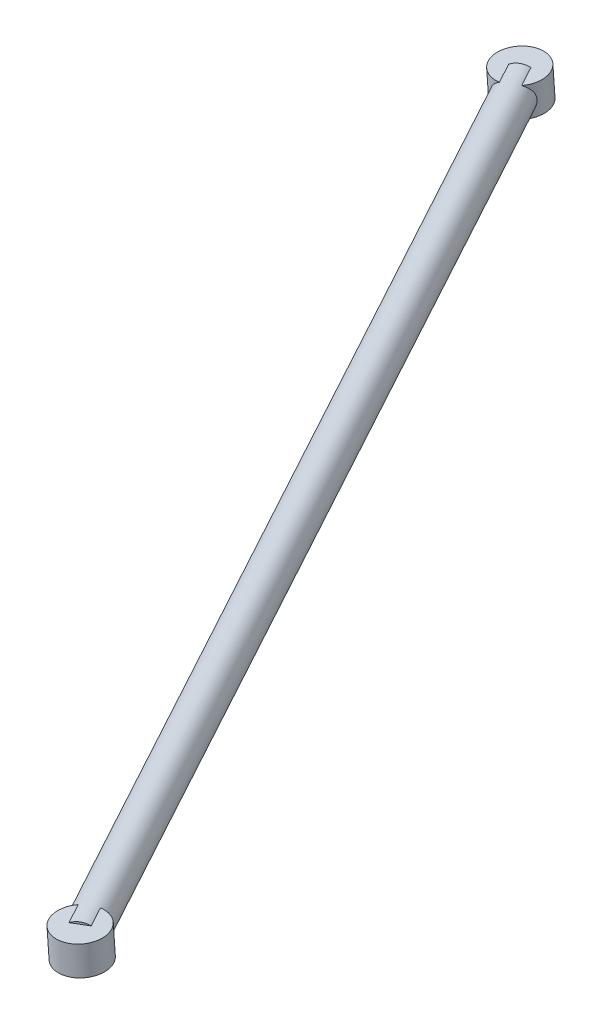
ISO-10303-21;
HEADER;
FILE_DESCRIPTION(('STEP AP214'),'2;1');
FILE_NAME('part.step','',(''),(''),'','','');
FILE_SCHEMA(('AUTOMOTIVE_DESIGN { 1 0 10303 214 1 1 1 1 }'));
ENDSEC;
DATA;
#1=APPLICATION_CONTEXT('core data for automotive mechanical design processes');
#2=APPLICATION_PROTOCOL_DEFINITION('international standard','automotive_design',2000,#1);
#3=PRODUCT_CONTEXT('',#1,'mechanical');
#4=PRODUCT('Part','Part','',(#3));
#5=PRODUCT_RELATED_PRODUCT_CATEGORY('part','',(#4));
#6=PRODUCT_DEFINITION_FORMATION('','',#4);
#7=PRODUCT_DEFINITION_CONTEXT('part definition',#1,'design');
#8=PRODUCT_DEFINITION('design','',#6,#7);
#9=PRODUCT_DEFINITION_SHAPE('','',#8);
#10=(LENGTH_UNIT() NAMED_UNIT(*) SI_UNIT(.MILLI.,.METRE.));
#11=(NAMED_UNIT(*) PLANE_ANGLE_UNIT() SI_UNIT($,.RADIAN.));
#12=(NAMED_UNIT(*) SI_UNIT($,.STERADIAN.) SOLID_ANGLE_UNIT());
#13=UNCERTAINTY_MEASURE_WITH_UNIT(LENGTH_MEASURE(1.E-05),#10,'distance_accuracy_value','');
#14=(GEOMETRIC_REPRESENTATION_CONTEXT(3) GLOBAL_UNCERTAINTY_ASSIGNED_CONTEXT((#13)) GLOBAL_UNIT_ASSIGNED_CONTEXT((#10,
#11,#12)) REPRESENTATION_CONTEXT('',''));
#15=CARTESIAN_POINT('',(0.,0.,0.));
#16=DIRECTION('',(0.,0.,1.));
#17=DIRECTION('',(1.,0.,0.));
#18=AXIS2_PLACEMENT_3D('',#15,#16,#17);
#19=CARTESIAN_POINT('',(535.6,-114.51,-83.23));
#20=DIRECTION('',(-0.464028683221349,0.0373067621610558,-0.885034229080954));
#21=DIRECTION('',(-0.885650765612241,0.,0.464351936972866));
#22=AXIS2_PLACEMENT_3D('',#19,#20,#21);
#23=CYLINDRICAL_SURFACE('',#22,7.99999999999999);
#24=CARTESIAN_POINT('',(527.257280147066,-107.296869973545,-90.184838852364));
#25=CARTESIAN_POINT('',(527.10912755688,-107.425437559921,-90.0227289563676));
#26=CARTESIAN_POINT('',(526.969476489393,-107.562605761105,-89.8598778253267));
#27=CARTESIAN_POINT('',(526.706769329285,-107.852602875344,-89.5350441192964));
#28=CARTESIAN_POINT('',(526.583699240574,-108.005418386183,-89.3730609240105));
#29=CARTESIAN_POINT('',(526.353124696478,-108.325909012441,-89.0515133267569));
#30=CARTESIAN_POINT('',(526.245671740722,-108.493630478055,-88.8919584144551));
#31=CARTESIAN_POINT('',(526.046023508878,-108.842475782773,-88.5779672454534));
#32=CARTESIAN_POINT('',(525.953831630866,-109.023602593792,-88.4235321348494));
#33=CARTESIAN_POINT('',(525.784146705437,-109.397896585341,-88.1225573528193));
#34=CARTESIAN_POINT('',(525.7066134234,-109.591028816219,-87.9759968837643));
#35=CARTESIAN_POINT('',(525.565074365398,-109.989235986968,-87.692858441975));
#36=CARTESIAN_POINT('',(525.501069669532,-110.194311878733,-87.5562812668585));
#37=CARTESIAN_POINT('',(525.385843311899,-110.61569715854,-87.2962935818472));
#38=CARTESIAN_POINT('',(525.33460284929,-110.831989450986,-87.1728638620028));
#39=CARTESIAN_POINT('',(525.24402171483,-111.275449959265,-86.9425723039694));
#40=CARTESIAN_POINT('',(525.204675506583,-111.502613057875,-86.83570276887));
#41=CARTESIAN_POINT('',(525.124921257572,-112.051302025162,-86.6078062109818));
#42=CARTESIAN_POINT('',(525.08923407072,-112.377348393684,-86.4955416386317));
#43=CARTESIAN_POINT('',(525.050068802157,-112.876948738949,-86.3649718756491));
#44=CARTESIAN_POINT('',(525.03940973437,-113.04514938127,-86.3277624322701));
#45=CARTESIAN_POINT('',(525.022702354311,-113.384230056956,-86.2672446855995));
#46=CARTESIAN_POINT('',(525.016651694678,-113.555108680921,-86.2439293064763));
#47=CARTESIAN_POINT('',(525.009009366558,-113.899830257075,-86.2121480596217));
#48=CARTESIAN_POINT('',(525.007456308939,-114.073686063011,-86.203811007261));
#49=CARTESIAN_POINT('',(525.008838544873,-114.421424396282,-86.202997527529));
#50=CARTESIAN_POINT('',(525.011773747156,-114.595306923002,-86.21052077763));
#51=CARTESIAN_POINT('',(525.022099169581,-114.941577840237,-86.2414166004957));
#52=CARTESIAN_POINT('',(525.029490921372,-115.113965696385,-86.2647946226495));
#53=CARTESIAN_POINT('',(525.04874319947,-115.455719661553,-86.3267455981055));
#54=CARTESIAN_POINT('',(525.060603764002,-115.625085744712,-86.3653186813827));
#55=CARTESIAN_POINT('',(525.087450163204,-115.942939176756,-86.4519465912168));
#56=CARTESIAN_POINT('',(525.102007721756,-116.091827452161,-86.4986764477566));
#57=CARTESIAN_POINT('',(525.134878192911,-116.385565878789,-86.602435544608));
#58=CARTESIAN_POINT('',(525.153192456153,-116.530414556328,-86.659468488283));
#59=CARTESIAN_POINT('',(525.213960169843,-116.958350233291,-86.8443689877527));
#60=CARTESIAN_POINT('',(525.262233435586,-117.23476493686,-86.9860205296479));
#61=CARTESIAN_POINT('',(525.363332517415,-117.710999539687,-87.2638635671444));
#62=CARTESIAN_POINT('',(525.413022092052,-117.914631908435,-87.3948429166545));
#63=CARTESIAN_POINT('',(525.523405764053,-118.309554956389,-87.6702995489685));
#64=CARTESIAN_POINT('',(525.584104839005,-118.500839999893,-87.8147829228002));
#65=CARTESIAN_POINT('',(525.717315705973,-118.871115067066,-88.1142536935648));
#66=CARTESIAN_POINT('',(525.789845450591,-119.050085808051,-88.2692568418079));
#67=CARTESIAN_POINT('',(525.94741071971,-119.395261240446,-88.5868905265932));
#68=CARTESIAN_POINT('',(526.032445071125,-119.561467127133,-88.7495203466848));
#69=CARTESIAN_POINT('',(526.214060026757,-119.877778982143,-89.0769657238344));
#70=CARTESIAN_POINT('',(526.310393429778,-120.028128936631,-89.241682665741));
#71=CARTESIAN_POINT('',(526.516493864179,-120.315640934559,-89.5741387392949));
#72=CARTESIAN_POINT('',(526.626258052445,-120.452805758172,-89.7418772249332));
#73=CARTESIAN_POINT('',(526.859551641261,-120.712880099335,-90.0780053971208));
#74=CARTESIAN_POINT('',(526.983045853992,-120.835824482007,-90.2463923980572));
#75=CARTESIAN_POINT('',(527.244515286275,-121.066898989694,-90.5823345370064));
#76=CARTESIAN_POINT('',(527.382501714152,-121.175017497106,-90.7498889246175));
#77=CARTESIAN_POINT('',(527.527885217287,-121.275148551619,-90.9159437152941));
#78=B_SPLINE_CURVE_WITH_KNOTS('',3,(#24,#25,#26,#27,#28,#29,#30,#31,#32,#33,#34,#35,#36,#37,#38,
#39,#40,#41,#42,#43,#44,#45,#46,#47,#48,#49,#50,#51,#52,#53,#54,#55,#56,#57,#58,#59,#60,#61,#62,
#63,#64,#65,#66,#67,#68,#69,#70,#71,#72,#73,#74,#75,#76,#77),.UNSPECIFIED.,.F.,.F.,(4,2,2,2,2,2,
2,2,2,2,2,2,2,2,2,2,2,2,2,2,2,2,2,2,2,2,4),(0.,0.762953061553605,1.52525802070631,
2.29002236651429,3.05495676864395,3.81776010385361,4.58062431696865,5.34235814945922,
6.1037368713343,7.13931927468659,7.65658625494786,8.17358958096658,8.6950182910626,
9.21643639772938,9.73803381010951,10.2596356842124,10.7293487092791,11.1992309061378,
12.1391873862655,12.8798164803661,13.6207812644578,14.3628810779214,15.1049113175282,
15.8329875081596,16.5609098406965,17.2870078536673,18.0136716271703),.UNSPECIFIED.);
#79=CARTESIAN_POINT('',(527.257280147066,-107.296869973545,-90.184838852364));
#80=VERTEX_POINT('',#79);
#81=CARTESIAN_POINT('',(527.527885217287,-121.275148551619,-90.9159437152941));
#82=VERTEX_POINT('',#81);
#83=EDGE_CURVE('E235',#80,#82,#78,.T.);
#84=ORIENTED_EDGE('',*,*,#83,.F.);
#85=CARTESIAN_POINT('',(525.336437695948,-107.142249855229,-93.8490286121603));
#86=CARTESIAN_POINT('',(526.589624302703,-107.243126355135,-91.4584558893537));
#87=CARTESIAN_POINT('',(527.842810924921,-107.344002854318,-89.067883174623));
#88=CARTESIAN_POINT('',(530.349184200286,-107.545755851236,-84.2867377613137));
#89=CARTESIAN_POINT('',(531.602370853432,-107.646632348972,-81.896165062735));
#90=CARTESIAN_POINT('',(532.855557522043,-107.747508845984,-79.5055923722323));
#91=B_SPLINE_CURVE_WITH_KNOTS('',3,(#85,#86,#87,#88,#89,#90),.UNSPECIFIED.,.F.,.F.,(4,2,4),(0.,
8.10304980507245,16.2060996101449),.UNSPECIFIED.);
#92=CARTESIAN_POINT('',(532.03412837787,-107.681387096497,-81.0725465500727));
#93=VERTEX_POINT('',#92);
#94=EDGE_CURVE('E145',#80,#93,#91,.T.);
#95=ORIENTED_EDGE('',*,*,#94,.T.);
#96=CARTESIAN_POINT('',(535.6,-114.51,-83.23));
#97=DIRECTION('',(-0.46402868322135,0.0373067621610557,-0.885034229080954));
#98=DIRECTION('',(-0.88565076561224,0.,0.464351936972866));
#99=AXIS2_PLACEMENT_3D('',#96,#97,#98);
#100=CIRCLE('',#99,7.99999999999999);
#101=CARTESIAN_POINT('',(538.894012428525,-107.360393009539,-84.6556935163909));
#102=VERTEX_POINT('',#101);
#103=EDGE_CURVE('E133',#93,#102,#100,.T.);
#104=ORIENTED_EDGE('',*,*,#103,.T.);
#105=CARTESIAN_POINT('',(541.5947027643,-107.57769751709,-79.5055923722315));
#106=CARTESIAN_POINT('',(540.341096981445,-107.476829162242,-81.8961650950414));
#107=CARTESIAN_POINT('',(539.087491183128,-107.375960808118,-84.2867378097737));
#108=CARTESIAN_POINT('',(536.58027955557,-107.174224101317,-89.0678832230832));
#109=CARTESIAN_POINT('',(535.32667372633,-107.07335574864,-91.4584559216605));
#110=CARTESIAN_POINT('',(534.073067881628,-106.972487396687,-93.8490286121603));
#111=B_SPLINE_CURVE_WITH_KNOTS('',3,(#105,#106,#107,#108,#109,#110),.UNSPECIFIED.,.F.,.F.,(4,2,
4),(0.,8.10363242266971,16.2072648453394),.UNSPECIFIED.);
#112=CARTESIAN_POINT('',(534.115909924604,-106.975934577703,-93.7673306698656));
#113=VERTEX_POINT('',#112);
#114=EDGE_CURVE('E241',#102,#113,#111,.T.);
#115=ORIENTED_EDGE('',*,*,#114,.T.);
#116=CARTESIAN_POINT('',(534.389023241594,-120.954095787557,-94.4997456740078));
#117=CARTESIAN_POINT('',(534.610980211892,-120.831415772004,-94.5210541644231));
#118=CARTESIAN_POINT('',(534.829000707599,-120.700503190521,-94.5343919098478));
#119=CARTESIAN_POINT('',(535.255417060849,-120.423579423923,-94.5468957710836));
#120=CARTESIAN_POINT('',(535.463820931756,-120.277581150554,-94.546073907766));
#121=CARTESIAN_POINT('',(535.870292201579,-119.971144161829,-94.5320358415843));
#122=CARTESIAN_POINT('',(536.068323907051,-119.810660174137,-94.5187794732207));
#123=CARTESIAN_POINT('',(536.451954594611,-119.476517552618,-94.4817519628768));
#124=CARTESIAN_POINT('',(536.637550803835,-119.302855998748,-94.4579784847182));
#125=CARTESIAN_POINT('',(536.994300966461,-118.943512695603,-94.4020398770927));
#126=CARTESIAN_POINT('',(537.16549367,-118.757865738516,-94.3698982824113));
#127=CARTESIAN_POINT('',(537.49238450858,-118.37447042685,-94.2993753905211));
#128=CARTESIAN_POINT('',(537.648081402753,-118.176721105186,-94.2609935942582));
#129=CARTESIAN_POINT('',(537.941762149753,-117.769593262585,-94.1804542535501));
#130=CARTESIAN_POINT('',(538.079772017751,-117.560232485797,-94.1383024130552));
#131=CARTESIAN_POINT('',(538.335774734013,-117.129982158138,-94.0529003145825));
#132=CARTESIAN_POINT('',(538.45377689797,-116.909098035592,-94.009650578635));
#133=CARTESIAN_POINT('',(538.705211872895,-116.374193107193,-93.9097901328085));
#134=CARTESIAN_POINT('',(538.828922287349,-116.055254849475,-93.8539706368417));
#135=CARTESIAN_POINT('',(538.97560627045,-115.564356536152,-93.7791857248859));
#136=CARTESIAN_POINT('',(539.018009000561,-115.398729048744,-93.7557577549481));
#137=CARTESIAN_POINT('',(539.088866028996,-115.064048025769,-93.7128152362971));
#138=CARTESIAN_POINT('',(539.117327423392,-114.894996278861,-93.6932986996786));
#139=CARTESIAN_POINT('',(539.159619694059,-114.553117205681,-93.6588213526348));
#140=CARTESIAN_POINT('',(539.173323428548,-114.380269958052,-93.643900910755));
#141=CARTESIAN_POINT('',(539.185154057171,-114.033661257375,-93.61935680581));
#142=CARTESIAN_POINT('',(539.183281266609,-113.859899822902,-93.6097330355325));
#143=CARTESIAN_POINT('',(539.163935750525,-113.512977832624,-93.5959024910247));
#144=CARTESIAN_POINT('',(539.146457628108,-113.339817505503,-93.591697592068));
#145=CARTESIAN_POINT('',(539.09637903327,-112.995663930137,-93.5884228222426));
#146=CARTESIAN_POINT('',(539.063778429536,-112.824670700723,-93.5893529959647));
#147=CARTESIAN_POINT('',(538.988289878648,-112.502954382735,-93.5953943613703));
#148=CARTESIAN_POINT('',(538.946744984023,-112.351904596349,-93.6000811900099));
#149=CARTESIAN_POINT('',(538.852919402203,-112.053283391331,-93.6124707119104));
#150=CARTESIAN_POINT('',(538.800634853583,-111.905713245133,-93.620174490817));
#151=CARTESIAN_POINT('',(538.628902384364,-111.468886906582,-93.6467548584687));
#152=CARTESIAN_POINT('',(538.494590925829,-111.185577510437,-93.669098747367));
#153=CARTESIAN_POINT('',(538.225216000522,-110.6958408048,-93.7120083514435));
#154=CARTESIAN_POINT('',(538.096348556287,-110.485847627326,-93.7319468020238));
#155=CARTESIAN_POINT('',(537.820834791308,-110.077661506663,-93.7712429379006));
#156=CARTESIAN_POINT('',(537.674180439072,-109.879473954857,-93.7906003558799));
#157=CARTESIAN_POINT('',(537.365093487589,-109.495078787826,-93.8263710001148));
#158=CARTESIAN_POINT('',(537.202637092034,-109.308889964931,-93.8427796766604));
#159=CARTESIAN_POINT('',(536.863897681495,-108.949176027623,-93.8704847669769));
#160=CARTESIAN_POINT('',(536.687615965149,-108.775649726744,-93.8817816602341));
#161=CARTESIAN_POINT('',(536.326151187843,-108.444933805437,-93.8971877149796));
#162=CARTESIAN_POINT('',(536.141199892002,-108.287497055598,-93.9014289324117));
#163=CARTESIAN_POINT('',(535.760713526742,-107.986041824039,-93.9014580679447));
#164=CARTESIAN_POINT('',(535.565180704381,-107.842020511001,-93.897247773979));
#165=CARTESIAN_POINT('',(535.16525181661,-107.568628064916,-93.8788292390801));
#166=CARTESIAN_POINT('',(534.960879129692,-107.439221208952,-93.8646460176022));
#167=CARTESIAN_POINT('',(534.544063120109,-107.195739171464,-93.8248907803468));
#168=CARTESIAN_POINT('',(534.331613628378,-107.081676023993,-93.7993098924157));
#169=CARTESIAN_POINT('',(534.115909924603,-106.975934577703,-93.7673306698656));
#170=B_SPLINE_CURVE_WITH_KNOTS('',3,(#116,#117,#118,#119,#120,#121,#122,#123,#124,#125,#126,
#127,#128,#129,#130,#131,#132,#133,#134,#135,#136,#137,#138,#139,#140,#141,#142,#143,#144,#145,
#146,#147,#148,#149,#150,#151,#152,#153,#154,#155,#156,#157,#158,#159,#160,#161,#162,#163,#164,
#165,#166,#167,#168,#169),.UNSPECIFIED.,.F.,.F.,(4,2,2,2,2,2,2,2,2,2,2,2,2,2,2,2,2,2,2,2,2,2,2,
2,2,2,4),(0.,0.763017342065641,1.52538694865104,2.29022764606423,3.05523832385197,
3.81812027380767,4.58106326455516,5.3428708678139,6.10432278949611,7.13972593898718,
7.6569035313707,8.17381760861144,8.69515028404995,9.21647240657171,9.73797489124076,
10.2594819044264,10.7292013609397,11.1990900009192,12.1390591859546,12.8797532323708,
13.6207829853056,14.3629464602414,15.1050403056596,15.8330818833565,16.560969458701,
17.2870374405321,18.0136715971829),.UNSPECIFIED.);
#171=CARTESIAN_POINT('',(534.389023241594,-120.954095787557,-94.4997456740078));
#172=VERTEX_POINT('',#171);
#173=EDGE_CURVE('E213',#172,#113,#170,.T.);
#174=ORIENTED_EDGE('',*,*,#173,.F.);
#175=CARTESIAN_POINT('',(542.24926238152,-121.586813490172,-79.505592372232));
#176=CARTESIAN_POINT('',(540.932100647346,-121.480787252857,-82.0182036633885));
#177=CARTESIAN_POINT('',(539.614938896097,-121.374761016341,-84.5308149456274));
#178=CARTESIAN_POINT('',(536.980615359447,-121.162708544907,-89.5560374922698));
#179=CARTESIAN_POINT('',(535.663453574046,-121.056682309989,-92.0686487566733));
#180=CARTESIAN_POINT('',(534.34629177157,-120.950656075869,-94.5812600121591));
#181=B_SPLINE_CURVE_WITH_KNOTS('',3,(#175,#176,#177,#178,#179,#180),.UNSPECIFIED.,.F.,.F.,(4,2,
4),(0.,8.51670997960851,17.033419959217),.UNSPECIFIED.);
#182=CARTESIAN_POINT('',(539.165871622131,-121.338612903503,-85.3874534499273));
#183=VERTEX_POINT('',#182);
#184=EDGE_CURVE('E220',#183,#172,#181,.T.);
#185=ORIENTED_EDGE('',*,*,#184,.F.);
#186=CARTESIAN_POINT('',(532.305987571475,-121.659606990461,-81.804306483609));
#187=VERTEX_POINT('',#186);
#188=EDGE_CURVE('E209',#183,#187,#100,.T.);
#189=ORIENTED_EDGE('',*,*,#188,.T.);
#190=CARTESIAN_POINT('',(525.605809580209,-121.120493383174,-94.5812600121603));
#191=CARTESIAN_POINT('',(526.923411805573,-121.226511061254,-92.0686487210001));
#192=CARTESIAN_POINT('',(528.24101404801,-121.332528738536,-89.5560374387594));
#193=CARTESIAN_POINT('',(530.87621856703,-121.544564091501,-84.5308148921166));
#194=CARTESIAN_POINT('',(532.193820843613,-121.650581767185,-82.0182036277146));
#195=CARTESIAN_POINT('',(533.511423137269,-121.75659944207,-79.505592372232));
#196=B_SPLINE_CURVE_WITH_KNOTS('',3,(#190,#191,#192,#193,#194,#195),.UNSPECIFIED.,.F.,.F.,(4,2,
4),(0.,8.5173222232888,17.0346444465776),.UNSPECIFIED.);
#197=EDGE_CURVE('E148',#82,#187,#196,.T.);
#198=ORIENTED_EDGE('',*,*,#197,.F.);
#199=EDGE_LOOP('',(#84,#95,#104,#115,#174,#185,#189,#198));
#200=FACE_BOUND('',#199,.T.);
#201=CARTESIAN_POINT('',(316.632815536966,-89.4914519064076,-508.572356838366));
#202=CARTESIAN_POINT('',(316.785483768125,-89.5966021396736,-508.746727654681));
#203=CARTESIAN_POINT('',(316.929987291129,-89.7105511883142,-508.922748362133));
#204=CARTESIAN_POINT('',(317.20301871195,-89.9547458001318,-509.275589529627));
#205=CARTESIAN_POINT('',(317.331560067543,-90.0849774468725,-509.452409183899));
#206=CARTESIAN_POINT('',(317.573670289178,-90.3610654643405,-509.805223112494));
#207=CARTESIAN_POINT('',(317.687189273789,-90.506971111869,-509.981212853761));
#208=CARTESIAN_POINT('',(317.899509903305,-90.8132274845533,-510.329525719559));
#209=CARTESIAN_POINT('',(317.998308271781,-90.9735814128161,-510.501848020519));
#210=CARTESIAN_POINT('',(318.181699855584,-91.3076499622713,-510.839920768989));
#211=CARTESIAN_POINT('',(318.266331833314,-91.4813261642698,-511.005688169123));
#212=CARTESIAN_POINT('',(318.422561411791,-91.8421149201933,-511.328561043239));
#213=CARTESIAN_POINT('',(318.49415796907,-92.029228548097,-511.485665823089));
#214=CARTESIAN_POINT('',(318.625039420475,-92.4164899478564,-511.787968215172));
#215=CARTESIAN_POINT('',(318.684342477925,-92.616617908257,-511.933183199397));
#216=CARTESIAN_POINT('',(318.791513139722,-93.0298743580247,-512.208282897123));
#217=CARTESIAN_POINT('',(318.839386070265,-93.2429967339214,-512.338174736551));
#218=CARTESIAN_POINT('',(318.939794885391,-93.7614378839896,-512.62181490633));
#219=CARTESIAN_POINT('',(318.987811818933,-94.0723405001403,-512.76733329071));
#220=CARTESIAN_POINT('',(319.045974310715,-94.5536534150233,-512.949116288999));
#221=CARTESIAN_POINT('',(319.063046176602,-94.7164978999605,-513.003609802496));
#222=CARTESIAN_POINT('',(319.092716686634,-95.0464749180424,-513.099061161865));
#223=CARTESIAN_POINT('',(319.105317605566,-95.213605224041,-513.140025890355));
#224=CARTESIAN_POINT('',(319.126210303377,-95.5525276524429,-513.207506804461));
#225=CARTESIAN_POINT('',(319.134464326893,-95.7243474121665,-513.233896490358));
#226=CARTESIAN_POINT('',(319.146522299986,-96.0698382516821,-513.270918358782));
#227=CARTESIAN_POINT('',(319.150326339638,-96.243509293929,-513.281550860263));
#228=CARTESIAN_POINT('',(319.153458504864,-96.5911899050319,-513.286912583808));
#229=CARTESIAN_POINT('',(319.15278508144,-96.7651995702209,-513.281636302507));
#230=CARTESIAN_POINT('',(319.146887891775,-97.1119723627681,-513.255673011368));
#231=CARTESIAN_POINT('',(319.14166408602,-97.2847354792887,-513.234985867708));
#232=CARTESIAN_POINT('',(319.127304913208,-97.6106560051234,-513.182014002963));
#233=CARTESIAN_POINT('',(319.118609490927,-97.7640566803199,-513.151084962077));
#234=CARTESIAN_POINT('',(319.097329953771,-98.068063984377,-513.078572159694));
#235=CARTESIAN_POINT('',(319.084744439397,-98.218669586978,-513.036984564592));
#236=CARTESIAN_POINT('',(319.040938188132,-98.6655816008062,-512.89782107929));
#237=CARTESIAN_POINT('',(319.003670414456,-98.9569196816866,-512.785855599297));
#238=CARTESIAN_POINT('',(318.921607258089,-99.4631011997901,-512.559378097565));
#239=CARTESIAN_POINT('',(318.88008273161,-99.6810675215521,-512.450438205575));
#240=CARTESIAN_POINT('',(318.78558262535,-100.106567682701,-512.21787142016));
#241=CARTESIAN_POINT('',(318.732601864111,-100.314096748975,-512.094237892489));
#242=CARTESIAN_POINT('',(318.614377224977,-100.718487079936,-511.83526809031));
#243=CARTESIAN_POINT('',(318.549114709428,-100.915331537915,-511.699914200849));
#244=CARTESIAN_POINT('',(318.405609698378,-101.297611102104,-511.42031670488));
#245=CARTESIAN_POINT('',(318.327368421231,-101.483047277005,-511.276073933594));
#246=CARTESIAN_POINT('',(318.158736326943,-101.838567937464,-510.983780568162));
#247=CARTESIAN_POINT('',(318.068603631502,-102.008876631956,-510.835853802143));
#248=CARTESIAN_POINT('',(317.874409346813,-102.337222774681,-510.535649785588));
#249=CARTESIAN_POINT('',(317.770350707973,-102.495262811028,-510.383373461927));
#250=CARTESIAN_POINT('',(317.547926829505,-102.797776891673,-510.076716377842));
#251=CARTESIAN_POINT('',(317.429598004133,-102.94228386095,-509.922341829733));
#252=CARTESIAN_POINT('',(317.177894842557,-103.217047799838,-509.612907191413));
#253=CARTESIAN_POINT('',(317.044508846079,-103.347293569681,-509.457846660498));
#254=CARTESIAN_POINT('',(316.903419332778,-103.469730383984,-509.303460875474));
#255=B_SPLINE_CURVE_WITH_KNOTS('',3,(#201,#202,#203,#204,#205,#206,#207,#208,#209,#210,#211,
#212,#213,#214,#215,#216,#217,#218,#219,#220,#221,#222,#223,#224,#225,#226,#227,#228,#229,#230,
#231,#232,#233,#234,#235,#236,#237,#238,#239,#240,#241,#242,#243,#244,#245,#246,#247,#248,#249,
#250,#251,#252,#253,#254),.UNSPECIFIED.,.F.,.F.,(4,2,2,2,2,2,2,2,2,2,2,2,2,2,2,2,2,2,2,2,2,2,2,
2,2,2,4),(0.,0.76301738512536,1.52538703508249,2.29022778475781,3.05523851474038,
3.81812051882214,4.5810635638203,5.34287121751485,6.10432318920499,7.13972619948522,
7.65690372245433,8.17381773038799,8.69515033123654,9.21647237920736,9.73797479013868,
10.2594817296383,10.7292011909186,11.1990898356739,12.1390590301421,12.8797531323946,
13.6207829412081,14.3629464709669,15.1050403710881,15.8330818400927,16.5609693066479,
17.2870371827904,18.0136712338322),.UNSPECIFIED.);
#256=CARTESIAN_POINT('',(316.632815536966,-89.4914519064076,-508.572356838366));
#257=VERTEX_POINT('',#256);
#258=CARTESIAN_POINT('',(316.903419332778,-103.469730383984,-509.303460875474));
#259=VERTEX_POINT('',#258);
#260=EDGE_CURVE('E12',#257,#259,#255,.T.);
#261=ORIENTED_EDGE('',*,*,#260,.F.);
#262=CARTESIAN_POINT('',(318.554891940629,-89.646107262906,-504.907039712893));
#263=CARTESIAN_POINT('',(317.237289463604,-89.5400894779449,-507.419651049913));
#264=CARTESIAN_POINT('',(315.919686969471,-89.4340716937843,-509.932262377996));
#265=CARTESIAN_POINT('',(313.284481946989,-89.2220361270644,-514.957485016288));
#266=CARTESIAN_POINT('',(311.966879418641,-89.1160183445051,-517.470096326496));
#267=CARTESIAN_POINT('',(310.649276873185,-89.0100005627463,-519.982707627767));
#268=B_SPLINE_CURVE_WITH_KNOTS('',3,(#262,#263,#264,#265,#266,#267),.UNSPECIFIED.,.F.,.F.,(4,2,
4),(0.,8.51732270740299,17.0346454148062),.UNSPECIFIED.);
#269=CARTESIAN_POINT('',(311.85471259849,-89.1069931064312,-517.683993609589));
#270=VERTEX_POINT('',#269);
#271=EDGE_CURVE('E192',#257,#270,#268,.T.);
#272=ORIENTED_EDGE('',*,*,#271,.T.);
#273=CARTESIAN_POINT('',(308.5607,-96.2566,-516.2583));
#274=DIRECTION('',(-0.46402868322135,0.0373067621610557,-0.885034229080954));
#275=DIRECTION('',(-0.88565076561224,0.,0.464351936972866));
#276=AXIS2_PLACEMENT_3D('',#273,#274,#275);
#277=CIRCLE('',#276,7.99999999999999);
#278=CARTESIAN_POINT('',(304.99482796191,-89.4279873788534,-514.100846343885));
#279=VERTEX_POINT('',#278);
#280=EDGE_CURVE('E132',#279,#270,#277,.T.);
#281=ORIENTED_EDGE('',*,*,#280,.F.);
#282=CARTESIAN_POINT('',(301.911437603664,-89.1797865175638,-519.982707627768));
#283=CARTESIAN_POINT('',(303.228599144311,-89.28581287041,-517.470096290751));
#284=CARTESIAN_POINT('',(304.545760702069,-89.3918392224556,-514.957484962669));
#285=CARTESIAN_POINT('',(307.180083851805,-89.6038919249457,-509.932262324378));
#286=CARTESIAN_POINT('',(308.497245443783,-89.7099182753902,-507.419651014168));
#287=CARTESIAN_POINT('',(309.814407052871,-89.8159446250342,-504.907039712894));
#288=B_SPLINE_CURVE_WITH_KNOTS('',3,(#282,#283,#284,#285,#286,#287),.UNSPECIFIED.,.F.,.F.,(4,2,
4),(0.,8.5167098449512,17.0334196899024),.UNSPECIFIED.);
#289=CARTESIAN_POINT('',(309.771675660917,-89.8125049153777,-504.988553915573));
#290=VERTEX_POINT('',#289);
#291=EDGE_CURVE('E186',#279,#290,#288,.T.);
#292=ORIENTED_EDGE('',*,*,#291,.T.);
#293=CARTESIAN_POINT('',(310.044790878062,-103.790665876129,-505.720969752072));
#294=CARTESIAN_POINT('',(309.81829252043,-103.679629336617,-505.687386902101));
#295=CARTESIAN_POINT('',(309.595389533987,-103.559426132589,-505.660863900316));
#296=CARTESIAN_POINT('',(309.158581619972,-103.30216143853,-505.620317440361));
#297=CARTESIAN_POINT('',(308.9446692097,-103.165114355777,-505.606283383393));
#298=CARTESIAN_POINT('',(308.526586126242,-102.874976379989,-505.589015363858));
#299=CARTESIAN_POINT('',(308.322449108798,-102.721835152207,-505.585816391088));
#300=CARTESIAN_POINT('',(307.926060751519,-102.400880205344,-505.588477676329));
#301=CARTESIAN_POINT('',(307.733812064729,-102.233063231196,-505.594339948949));
#302=CARTESIAN_POINT('',(307.363257686532,-101.88404867832,-505.613129642206));
#303=CARTESIAN_POINT('',(307.18491464279,-101.702889679789,-505.626037334201));
#304=CARTESIAN_POINT('',(306.843222696156,-101.327294362248,-505.656768036477));
#305=CARTESIAN_POINT('',(306.679874991051,-101.132856984755,-505.674591438957));
#306=CARTESIAN_POINT('',(306.370411362304,-100.731344251624,-505.712749326698));
#307=CARTESIAN_POINT('',(306.224270264025,-100.524288049281,-505.733080052017));
#308=CARTESIAN_POINT('',(305.951530608889,-100.097828442073,-505.773597009615));
#309=CARTESIAN_POINT('',(305.824922973315,-99.8784308383109,-505.793783304837));
#310=CARTESIAN_POINT('',(305.552578040221,-99.3462176444059,-505.837766716448));
#311=CARTESIAN_POINT('',(305.416372585151,-99.0282146257062,-505.860246042076));
#312=CARTESIAN_POINT('',(305.250452659831,-98.5382107948102,-505.883692996219));
#313=CARTESIAN_POINT('',(305.201559137584,-98.372796783944,-505.889796146301));
#314=CARTESIAN_POINT('',(305.117586763509,-98.038427188961,-505.897725522915));
#315=CARTESIAN_POINT('',(305.082500882959,-97.8694734529815,-505.899553927836));
#316=CARTESIAN_POINT('',(305.026813616509,-97.5277152277827,-505.898256042103));
#317=CARTESIAN_POINT('',(305.006338784049,-97.3548901562631,-505.895087206835));
#318=CARTESIAN_POINT('',(304.980934366334,-97.0082758585499,-505.883353127896));
#319=CARTESIAN_POINT('',(304.976004464968,-96.8344866520342,-505.874787993964));
#320=CARTESIAN_POINT('',(304.981773326542,-96.4874625990323,-505.852298779526));
#321=CARTESIAN_POINT('',(304.992477464447,-96.3142279637303,-505.8383728572));
#322=CARTESIAN_POINT('',(305.029098188549,-95.969859496831,-505.805606238901));
#323=CARTESIAN_POINT('',(305.055014904873,-95.7987256832164,-505.786765500888));
#324=CARTESIAN_POINT('',(305.117926558767,-95.4766721843883,-505.747021239514));
#325=CARTESIAN_POINT('',(305.153562957826,-95.3254351826667,-505.726509374443));
#326=CARTESIAN_POINT('',(305.235706070112,-95.0263149246048,-505.682825735011));
#327=CARTESIAN_POINT('',(305.282216693766,-94.8784328957669,-505.659653005318));
#328=CARTESIAN_POINT('',(305.436853974405,-94.4404177721727,-505.587265759093));
#329=CARTESIAN_POINT('',(305.560073194929,-94.1559784207294,-505.535190489375));
#330=CARTESIAN_POINT('',(305.810248644791,-93.6633066391122,-505.440829907412));
#331=CARTESIAN_POINT('',(305.930871289672,-93.4517048601536,-505.398810335891));
#332=CARTESIAN_POINT('',(306.19033892754,-93.0394753790155,-505.316539429385));
#333=CARTESIAN_POINT('',(306.329192155023,-92.838852694305,-505.276288904485));
#334=CARTESIAN_POINT('',(306.6231240642,-92.4485903544708,-505.199929103696));
#335=CARTESIAN_POINT('',(306.778227274669,-92.2589679942105,-505.163826265933));
#336=CARTESIAN_POINT('',(307.102730878351,-91.8912351320058,-505.097993283406));
#337=CARTESIAN_POINT('',(307.2721299298,-91.7131235524596,-505.068262541503));
#338=CARTESIAN_POINT('',(307.620465800442,-91.3720137354067,-505.017628213594));
#339=CARTESIAN_POINT('',(307.79916335313,-91.2087942743537,-504.99656914435));
#340=CARTESIAN_POINT('',(308.167640990725,-90.8943960760924,-504.964234423341));
#341=CARTESIAN_POINT('',(308.357418725676,-90.7432148017114,-504.952956705072));
#342=CARTESIAN_POINT('',(308.746380984166,-90.4540232690262,-504.941853575096));
#343=CARTESIAN_POINT('',(308.945540740357,-90.3159809510338,-504.941999532397));
#344=CARTESIAN_POINT('',(309.352499948039,-90.0536286818783,-504.95520002125));
#345=CARTESIAN_POINT('',(309.560306010482,-89.9293295144911,-504.968264610798));
#346=CARTESIAN_POINT('',(309.771675660917,-89.8125049153777,-504.988553915572));
#347=B_SPLINE_CURVE_WITH_KNOTS('',3,(#293,#294,#295,#296,#297,#298,#299,#300,#301,#302,#303,
#304,#305,#306,#307,#308,#309,#310,#311,#312,#313,#314,#315,#316,#317,#318,#319,#320,#321,#322,
#323,#324,#325,#326,#327,#328,#329,#330,#331,#332,#333,#334,#335,#336,#337,#338,#339,#340,#341,
#342,#343,#344,#345,#346),.UNSPECIFIED.,.F.,.F.,(4,2,2,2,2,2,2,2,2,2,2,2,2,2,2,2,2,2,2,2,2,2,2,
2,2,2,4),(0.,0.762953027963071,1.52525795332941,2.29002225917327,3.0549566213795,
3.81775991542245,4.58062408728456,5.34235788116621,6.10373656473378,7.13931906337583,
7.65658609115445,8.17358946461688,8.69501822574228,9.21643638341182,9.73803384623831,
10.2596357707521,10.7293487927062,11.1992309864464,12.1391874604485,12.8798165198533,
13.6207812692586,14.3628810486164,15.1049112540675,15.832987370271,16.5609096284776,
17.2870075642194,18.0136712600015),.UNSPECIFIED.);
#348=CARTESIAN_POINT('',(310.044790878062,-103.790665876129,-505.720969752072));
#349=VERTEX_POINT('',#348);
#350=EDGE_CURVE('E75',#349,#290,#347,.T.);
#351=ORIENTED_EDGE('',*,*,#350,.F.);
#352=CARTESIAN_POINT('',(302.565996966555,-103.188902358891,-519.982707627768));
#353=CARTESIAN_POINT('',(303.819602937686,-103.2897708113,-517.592134959101));
#354=CARTESIAN_POINT('',(305.073208924309,-103.390639262984,-515.201562298528));
#355=CARTESIAN_POINT('',(307.580420928542,-103.592376164903,-510.42041699357));
#356=CARTESIAN_POINT('',(308.834026946152,-103.693244615137,-508.029844349184));
#357=CARTESIAN_POINT('',(310.087632979255,-103.794113064646,-505.639271712893));
#358=B_SPLINE_CURVE_WITH_KNOTS('',3,(#352,#353,#354,#355,#356,#357),.UNSPECIFIED.,.F.,.F.,(4,2,
4),(0.,8.10363255198013,16.2072651039601),.UNSPECIFIED.);
#359=CARTESIAN_POINT('',(305.266687725017,-103.40620707799,-514.832606567801));
#360=VERTEX_POINT('',#359);
#361=EDGE_CURVE('E136',#360,#349,#358,.T.);
#362=ORIENTED_EDGE('',*,*,#361,.F.);
#363=CARTESIAN_POINT('',(312.126571722338,-103.085212835481,-518.415753499599));
#364=VERTEX_POINT('',#363);
#365=EDGE_CURVE('E127',#364,#360,#277,.T.);
#366=ORIENTED_EDGE('',*,*,#365,.F.);
#367=CARTESIAN_POINT('',(318.824261153416,-103.624350642761,-505.639271712893));
#368=CARTESIAN_POINT('',(317.571074782146,-103.523474037059,-508.029844381556));
#369=CARTESIAN_POINT('',(316.317888395381,-103.422597432082,-510.420417042128));
#370=CARTESIAN_POINT('',(313.811515590861,-103.220844223578,-515.201562347086));
#371=CARTESIAN_POINT('',(312.558329173106,-103.119967620051,-517.592134991473));
#372=CARTESIAN_POINT('',(311.305142739856,-103.019091017249,-519.982707627767));
#373=B_SPLINE_CURVE_WITH_KNOTS('',3,(#367,#368,#369,#370,#371,#372),.UNSPECIFIED.,.F.,.F.,(4,2,
4),(0.,8.10304934539365,16.2060986907873),.UNSPECIFIED.);
#374=EDGE_CURVE('E82',#259,#364,#373,.T.);
#375=ORIENTED_EDGE('',*,*,#374,.F.);
#376=EDGE_LOOP('',(#261,#272,#281,#292,#351,#362,#366,#375));
#377=FACE_BOUND('',#376,.T.);
#378=ADVANCED_FACE('F61',(#200,#377),#23,.T.);
#379=CARTESIAN_POINT('',(308.5607,-96.2566,-516.2583));
#380=DIRECTION('',(-0.46402868322135,0.0373067621610557,-0.885034229080954));
#381=DIRECTION('',(-0.88565076561224,0.,0.464351936972866));
#382=AXIS2_PLACEMENT_3D('',#379,#380,#381);
#383=PLANE('',#382);
#384=ORIENTED_EDGE('',*,*,#280,.T.);
#385=DIRECTION('',(-0.885607306760895,-0.0414401827648203,0.462582327228497));
#386=VECTOR('',#385,1.);
#387=CARTESIAN_POINT('',(308.4247702802,-89.2674902426423,-515.892419976737));
#388=LINE('',#387,#386);
#389=EDGE_CURVE('E144',#270,#279,#388,.T.);
#390=ORIENTED_EDGE('',*,*,#389,.T.);
#391=EDGE_LOOP('',(#384,#390));
#392=FACE_BOUND('',#391,.T.);
#393=ADVANCED_FACE('F266',(#392),#383,.T.);
#394=CARTESIAN_POINT('',(535.6,-114.51,-83.23));
#395=DIRECTION('',(-0.46402868322135,0.0373067621610557,-0.885034229080954));
#396=DIRECTION('',(-0.88565076561224,0.,0.464351936972866));
#397=AXIS2_PLACEMENT_3D('',#394,#395,#396);
#398=PLANE('',#397);
#399=DIRECTION('',(-0.885607307157362,-0.0414401623796375,0.462582328295661));
#400=VECTOR('',#399,1.);
#401=CARTESIAN_POINT('',(535.464070403197,-107.520890053018,-82.8641200332318));
#402=LINE('',#401,#400);
#403=EDGE_CURVE('E206',#102,#93,#402,.T.);
#404=ORIENTED_EDGE('',*,*,#403,.F.);
#405=ORIENTED_EDGE('',*,*,#103,.F.);
#406=EDGE_LOOP('',(#404,#405));
#407=FACE_BOUND('',#406,.T.);
#408=ADVANCED_FACE('F264',(#407),#398,.F.);
#409=ORIENTED_EDGE('',*,*,#188,.F.);
#410=DIRECTION('',(-0.885607307157362,-0.0414401623796375,0.462582328295661));
#411=VECTOR('',#410,1.);
#412=CARTESIAN_POINT('',(535.735929596803,-121.499109946982,-83.5958799667681));
#413=LINE('',#412,#411);
#414=EDGE_CURVE('E204',#183,#187,#413,.T.);
#415=ORIENTED_EDGE('',*,*,#414,.T.);
#416=EDGE_LOOP('',(#409,#415));
#417=FACE_BOUND('',#416,.T.);
#418=ADVANCED_FACE('F63',(#417),#398,.F.);
#419=DIRECTION('',(-0.885607306760895,-0.0414401827648203,0.462582327228497));
#420=VECTOR('',#419,1.);
#421=CARTESIAN_POINT('',(308.696629723678,-103.245709956736,-516.6241800337));
#422=LINE('',#421,#420);
#423=EDGE_CURVE('E131',#364,#360,#422,.T.);
#424=ORIENTED_EDGE('',*,*,#423,.F.);
#425=ORIENTED_EDGE('',*,*,#365,.T.);
#426=EDGE_LOOP('',(#424,#425));
#427=FACE_BOUND('',#426,.T.);
#428=ADVANCED_FACE('F129',(#427),#383,.T.);
#429=CARTESIAN_POINT('',(535.464194,-107.5209,-82.8638843));
#430=DIRECTION('',(0.0194008565914509,-0.998442828764438,-0.0523022413705742));
#431=DIRECTION('',(0.,0.052312087255057,-0.998630785389185));
#432=AXIS2_PLACEMENT_3D('',#429,#430,#431);
#433=PLANE('',#432);
#434=ORIENTED_EDGE('',*,*,#114,.F.);
#435=ORIENTED_EDGE('',*,*,#403,.T.);
#436=ORIENTED_EDGE('',*,*,#94,.F.);
#437=CARTESIAN_POINT('',(535.464194,-107.5209,-82.8638843));
#438=DIRECTION('',(0.0194008565914509,-0.998442828764438,-0.0523022413705742));
#439=DIRECTION('',(0.,0.052312087255057,-0.998630785389185));
#440=AXIS2_PLACEMENT_3D('',#437,#438,#439);
#441=CIRCLE('',#440,11.);
#442=EDGE_CURVE('E198',#113,#80,#441,.T.);
#443=ORIENTED_EDGE('',*,*,#442,.F.);
#444=EDGE_LOOP('',(#434,#435,#436,#443));
#445=FACE_BOUND('',#444,.T.);
#446=ADVANCED_FACE('F166',(#445),#433,.F.);
#447=CARTESIAN_POINT('',(535.735806,-121.4991,-83.5961157));
#448=DIRECTION('',(0.0194008565914509,-0.998442828764438,-0.0523022413705742));
#449=DIRECTION('',(0.,0.052312087255057,-0.998630785389185));
#450=AXIS2_PLACEMENT_3D('',#447,#448,#449);
#451=PLANE('',#450);
#452=ORIENTED_EDGE('',*,*,#414,.F.);
#453=ORIENTED_EDGE('',*,*,#184,.T.);
#454=CARTESIAN_POINT('',(535.735806,-121.4991,-83.5961157));
#455=DIRECTION('',(0.0194008565914509,-0.998442828764438,-0.0523022413705742));
#456=DIRECTION('',(0.,0.052312087255057,-0.998630785389185));
#457=AXIS2_PLACEMENT_3D('',#454,#455,#456);
#458=CIRCLE('',#457,11.);
#459=EDGE_CURVE('E201',#172,#82,#458,.T.);
#460=ORIENTED_EDGE('',*,*,#459,.T.);
#461=ORIENTED_EDGE('',*,*,#197,.T.);
#462=EDGE_LOOP('',(#452,#453,#460,#461));
#463=FACE_BOUND('',#462,.T.);
#464=ADVANCED_FACE('F230',(#463),#451,.T.);
#465=CARTESIAN_POINT('',(535.464194,-107.5209,-82.8638843));
#466=DIRECTION('',(0.0194008565914351,-0.998442828764438,-0.0523022413705735));
#467=DIRECTION('',(0.,0.0523120872550563,-0.998630785389184));
#468=AXIS2_PLACEMENT_3D('',#465,#466,#467);
#469=CYLINDRICAL_SURFACE('',#468,11.);
#470=ORIENTED_EDGE('',*,*,#442,.T.);
#471=ORIENTED_EDGE('',*,*,#83,.T.);
#472=ORIENTED_EDGE('',*,*,#459,.F.);
#473=ORIENTED_EDGE('',*,*,#173,.T.);
#474=EDGE_LOOP('',(#470,#471,#472,#473));
#475=FACE_BOUND('',#474,.T.);
#476=ADVANCED_FACE('F227',(#475),#469,.T.);
#477=CARTESIAN_POINT('',(308.424894,-89.2675002,-515.892184));
#478=DIRECTION('',(0.0194008568246632,-0.998442826481946,-0.0523022848565095));
#479=DIRECTION('',(0.,0.0523121307494153,-0.998630783110783));
#480=AXIS2_PLACEMENT_3D('',#477,#478,#479);
#481=PLANE('',#480);
#482=ORIENTED_EDGE('',*,*,#271,.F.);
#483=CARTESIAN_POINT('',(308.424894,-89.2675002,-515.892184));
#484=DIRECTION('',(0.0194008568246632,-0.998442826481946,-0.0523022848565095));
#485=DIRECTION('',(0.,0.0523121307494153,-0.998630783110783));
#486=AXIS2_PLACEMENT_3D('',#483,#484,#485);
#487=CIRCLE('',#486,11.);
#488=EDGE_CURVE('E391',#290,#257,#487,.T.);
#489=ORIENTED_EDGE('',*,*,#488,.F.);
#490=ORIENTED_EDGE('',*,*,#291,.F.);
#491=ORIENTED_EDGE('',*,*,#389,.F.);
#492=EDGE_LOOP('',(#482,#489,#490,#491));
#493=FACE_BOUND('',#492,.T.);
#494=ADVANCED_FACE('F171',(#493),#481,.F.);
#495=CARTESIAN_POINT('',(308.696506,-103.2457,-516.624416));
#496=DIRECTION('',(0.0194008568246632,-0.998442826481946,-0.0523022848565095));
#497=DIRECTION('',(0.,0.0523121307494153,-0.998630783110783));
#498=AXIS2_PLACEMENT_3D('',#495,#496,#497);
#499=PLANE('',#498);
#500=CARTESIAN_POINT('',(308.696506,-103.2457,-516.624416));
#501=DIRECTION('',(0.0194008568246632,-0.998442826481946,-0.0523022848565095));
#502=DIRECTION('',(0.,0.0523121307494153,-0.998630783110783));
#503=AXIS2_PLACEMENT_3D('',#500,#501,#502);
#504=CIRCLE('',#503,11.);
#505=EDGE_CURVE('E141',#349,#259,#504,.T.);
#506=ORIENTED_EDGE('',*,*,#505,.T.);
#507=ORIENTED_EDGE('',*,*,#374,.T.);
#508=ORIENTED_EDGE('',*,*,#423,.T.);
#509=ORIENTED_EDGE('',*,*,#361,.T.);
#510=EDGE_LOOP('',(#506,#507,#508,#509));
#511=FACE_BOUND('',#510,.T.);
#512=ADVANCED_FACE('F143',(#511),#499,.T.);
#513=CARTESIAN_POINT('',(308.424894,-89.2675002,-515.892184));
#514=DIRECTION('',(0.0194008568246672,-0.998442826481947,-0.0523022848564858));
#515=DIRECTION('',(0.,0.0523121307493916,-0.998630783110784));
#516=AXIS2_PLACEMENT_3D('',#513,#514,#515);
#517=CYLINDRICAL_SURFACE('',#516,11.);
#518=ORIENTED_EDGE('',*,*,#488,.T.);
#519=ORIENTED_EDGE('',*,*,#260,.T.);
#520=ORIENTED_EDGE('',*,*,#505,.F.);
#521=ORIENTED_EDGE('',*,*,#350,.T.);
#522=EDGE_LOOP('',(#518,#519,#520,#521));
#523=FACE_BOUND('',#522,.T.);
#524=ADVANCED_FACE('F161',(#523),#517,.T.);
#525=CLOSED_SHELL('',(#378,#393,#408,#418,#428,#446,#464,#476,#494,#512,#524));
#526=MANIFOLD_SOLID_BREP('B2',#525);
#527=ADVANCED_BREP_SHAPE_REPRESENTATION('',(#18,#526),#14);
#528=SHAPE_DEFINITION_REPRESENTATION(#9,#527);
ENDSEC;
END-ISO-10303-21;
